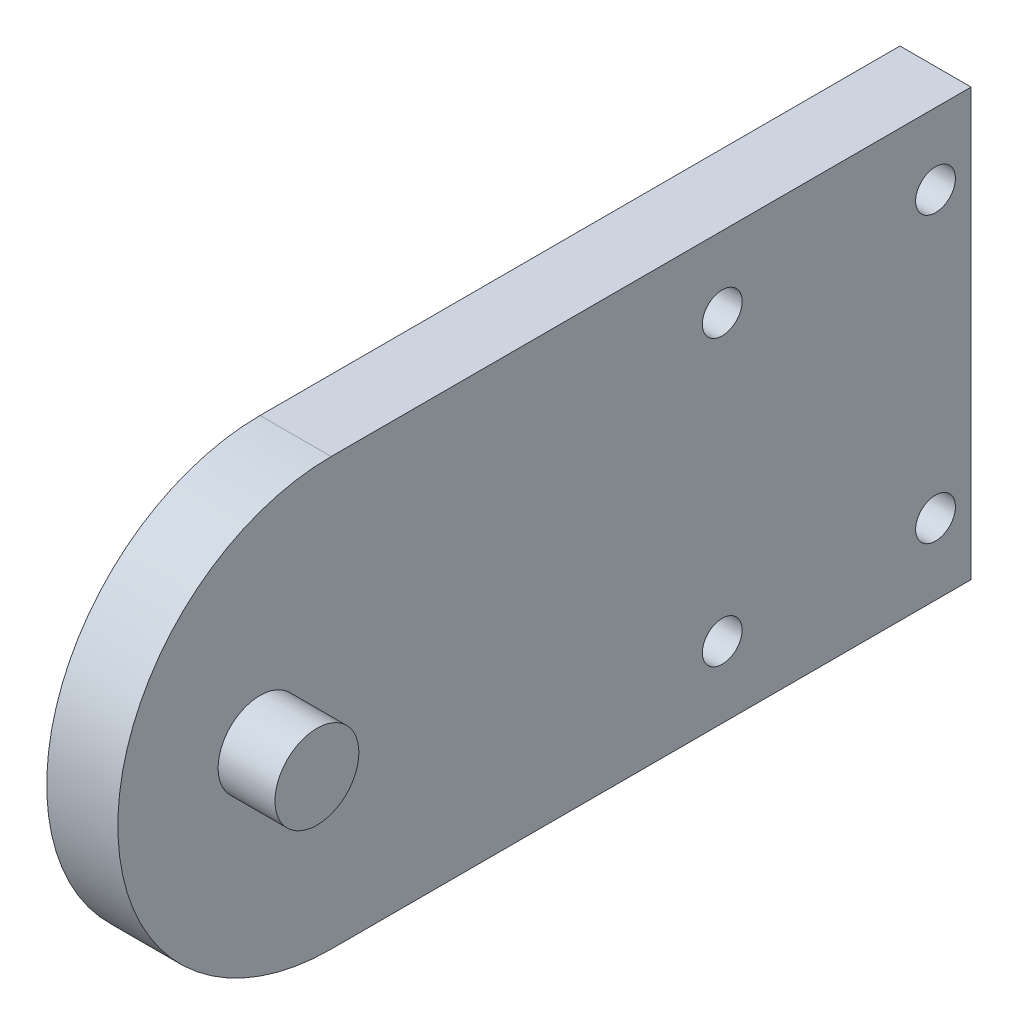
ISO-10303-21;
HEADER;
FILE_DESCRIPTION(('STEP AP214'),'2;1');
FILE_NAME('part.step','',(''),(''),'','','');
FILE_SCHEMA(('AUTOMOTIVE_DESIGN { 1 0 10303 214 1 1 1 1 }'));
ENDSEC;
DATA;
#1=APPLICATION_CONTEXT('core data for automotive mechanical design processes');
#2=APPLICATION_PROTOCOL_DEFINITION('international standard','automotive_design',2000,#1);
#3=PRODUCT_CONTEXT('',#1,'mechanical');
#4=PRODUCT('Part','Part','',(#3));
#5=PRODUCT_RELATED_PRODUCT_CATEGORY('part','',(#4));
#6=PRODUCT_DEFINITION_FORMATION('','',#4);
#7=PRODUCT_DEFINITION_CONTEXT('part definition',#1,'design');
#8=PRODUCT_DEFINITION('design','',#6,#7);
#9=PRODUCT_DEFINITION_SHAPE('','',#8);
#10=(LENGTH_UNIT() NAMED_UNIT(*) SI_UNIT(.MILLI.,.METRE.));
#11=(NAMED_UNIT(*) PLANE_ANGLE_UNIT() SI_UNIT($,.RADIAN.));
#12=(NAMED_UNIT(*) SI_UNIT($,.STERADIAN.) SOLID_ANGLE_UNIT());
#13=UNCERTAINTY_MEASURE_WITH_UNIT(LENGTH_MEASURE(1.E-05),#10,'distance_accuracy_value','');
#14=(GEOMETRIC_REPRESENTATION_CONTEXT(3) GLOBAL_UNCERTAINTY_ASSIGNED_CONTEXT((#13)) GLOBAL_UNIT_ASSIGNED_CONTEXT((#10,
#11,#12)) REPRESENTATION_CONTEXT('',''));
#15=CARTESIAN_POINT('',(0.,0.,0.));
#16=DIRECTION('',(0.,0.,1.));
#17=DIRECTION('',(1.,0.,0.));
#18=AXIS2_PLACEMENT_3D('',#15,#16,#17);
#19=CARTESIAN_POINT('',(0.,30.,0.));
#20=DIRECTION('',(0.,1.,0.));
#21=DIRECTION('',(0.,0.,1.));
#22=AXIS2_PLACEMENT_3D('',#19,#20,#21);
#23=PLANE('',#22);
#24=DIRECTION('',(0.,0.,1.));
#25=VECTOR('',#24,1.);
#26=CARTESIAN_POINT('',(-2.5,30.,-30.));
#27=LINE('',#26,#25);
#28=CARTESIAN_POINT('',(-2.5,30.,-30.));
#29=VERTEX_POINT('',#28);
#30=CARTESIAN_POINT('',(-2.5,30.,15.));
#31=VERTEX_POINT('',#30);
#32=EDGE_CURVE('E104',#29,#31,#27,.T.);
#33=ORIENTED_EDGE('',*,*,#32,.T.);
#34=DIRECTION('',(-1.,0.,0.));
#35=VECTOR('',#34,1.);
#36=CARTESIAN_POINT('',(7.5,30.,15.));
#37=LINE('',#36,#35);
#38=CARTESIAN_POINT('',(2.5,30.,15.));
#39=VERTEX_POINT('',#38);
#40=EDGE_CURVE('E12',#31,#39,#37,.F.);
#41=ORIENTED_EDGE('',*,*,#40,.T.);
#42=DIRECTION('',(0.,0.,-1.));
#43=VECTOR('',#42,1.);
#44=CARTESIAN_POINT('',(2.5,30.,-30.));
#45=LINE('',#44,#43);
#46=CARTESIAN_POINT('',(2.5,30.,-30.));
#47=VERTEX_POINT('',#46);
#48=EDGE_CURVE('E144',#39,#47,#45,.T.);
#49=ORIENTED_EDGE('',*,*,#48,.T.);
#50=DIRECTION('',(-1.,0.,0.));
#51=VECTOR('',#50,1.);
#52=CARTESIAN_POINT('',(-2.5,30.,-30.));
#53=LINE('',#52,#51);
#54=EDGE_CURVE('E81',#47,#29,#53,.T.);
#55=ORIENTED_EDGE('',*,*,#54,.T.);
#56=EDGE_LOOP('',(#33,#41,#49,#55));
#57=FACE_BOUND('',#56,.T.);
#58=ADVANCED_FACE('F57',(#57),#23,.T.);
#59=CARTESIAN_POINT('',(-2.5,30.,-30.));
#60=DIRECTION('',(1.,0.,0.));
#61=DIRECTION('',(0.,0.,-1.));
#62=AXIS2_PLACEMENT_3D('',#59,#60,#61);
#63=PLANE('',#62);
#64=CARTESIAN_POINT('',(-2.5,25.,-27.5));
#65=DIRECTION('',(-1.,0.,0.));
#66=DIRECTION('',(0.,0.,1.));
#67=AXIS2_PLACEMENT_3D('',#64,#65,#66);
#68=CIRCLE('',#67,1.4);
#69=CARTESIAN_POINT('',(-2.5,25.,-26.1));
#70=VERTEX_POINT('',#69);
#71=EDGE_CURVE('E127',#70,#70,#68,.T.);
#72=ORIENTED_EDGE('',*,*,#71,.F.);
#73=EDGE_LOOP('',(#72));
#74=FACE_BOUND('',#73,.T.);
#75=CARTESIAN_POINT('',(-2.5,25.,-12.5));
#76=DIRECTION('',(-1.,0.,0.));
#77=DIRECTION('',(0.,0.,1.));
#78=AXIS2_PLACEMENT_3D('',#75,#76,#77);
#79=CIRCLE('',#78,1.4);
#80=CARTESIAN_POINT('',(-2.5,25.,-11.1));
#81=VERTEX_POINT('',#80);
#82=EDGE_CURVE('E153',#81,#81,#79,.T.);
#83=ORIENTED_EDGE('',*,*,#82,.F.);
#84=EDGE_LOOP('',(#83));
#85=FACE_BOUND('',#84,.T.);
#86=CARTESIAN_POINT('',(-2.5,5.,-12.5));
#87=DIRECTION('',(-1.,0.,0.));
#88=DIRECTION('',(0.,0.,-1.));
#89=AXIS2_PLACEMENT_3D('',#86,#87,#88);
#90=CIRCLE('',#89,1.4);
#91=CARTESIAN_POINT('',(-2.5,5.,-13.9));
#92=VERTEX_POINT('',#91);
#93=EDGE_CURVE('E157',#92,#92,#90,.T.);
#94=ORIENTED_EDGE('',*,*,#93,.F.);
#95=EDGE_LOOP('',(#94));
#96=FACE_BOUND('',#95,.T.);
#97=CARTESIAN_POINT('',(-2.5,5.,-27.5));
#98=DIRECTION('',(-1.,0.,0.));
#99=DIRECTION('',(0.,0.,-1.));
#100=AXIS2_PLACEMENT_3D('',#97,#98,#99);
#101=CIRCLE('',#100,1.4);
#102=CARTESIAN_POINT('',(-2.5,5.,-28.9));
#103=VERTEX_POINT('',#102);
#104=EDGE_CURVE('E154',#103,#103,#101,.T.);
#105=ORIENTED_EDGE('',*,*,#104,.F.);
#106=EDGE_LOOP('',(#105));
#107=FACE_BOUND('',#106,.T.);
#108=CARTESIAN_POINT('',(-2.5,15.,15.));
#109=DIRECTION('',(-1.,0.,0.));
#110=DIRECTION('',(0.,0.,1.));
#111=AXIS2_PLACEMENT_3D('',#108,#109,#110);
#112=CIRCLE('',#111,15.);
#113=CARTESIAN_POINT('',(-2.5,0.,15.));
#114=VERTEX_POINT('',#113);
#115=EDGE_CURVE('E72',#114,#31,#112,.T.);
#116=ORIENTED_EDGE('',*,*,#115,.T.);
#117=ORIENTED_EDGE('',*,*,#32,.F.);
#118=DIRECTION('',(0.,-1.,0.));
#119=VECTOR('',#118,1.);
#120=CARTESIAN_POINT('',(-2.5,30.,-30.));
#121=LINE('',#120,#119);
#122=CARTESIAN_POINT('',(-2.5,0.,-30.));
#123=VERTEX_POINT('',#122);
#124=EDGE_CURVE('E97',#29,#123,#121,.T.);
#125=ORIENTED_EDGE('',*,*,#124,.T.);
#126=DIRECTION('',(0.,0.,1.));
#127=VECTOR('',#126,1.);
#128=CARTESIAN_POINT('',(-2.5,0.,-30.));
#129=LINE('',#128,#127);
#130=EDGE_CURVE('E109',#123,#114,#129,.T.);
#131=ORIENTED_EDGE('',*,*,#130,.T.);
#132=EDGE_LOOP('',(#116,#117,#125,#131));
#133=FACE_BOUND('',#132,.T.);
#134=ADVANCED_FACE('F59',(#74,#85,#96,#107,#133),#63,.F.);
#135=CARTESIAN_POINT('',(2.5,30.,-30.));
#136=DIRECTION('',(-1.,0.,0.));
#137=DIRECTION('',(0.,0.,1.));
#138=AXIS2_PLACEMENT_3D('',#135,#136,#137);
#139=PLANE('',#138);
#140=CARTESIAN_POINT('',(2.5,25.,-27.5));
#141=DIRECTION('',(-1.,0.,0.));
#142=DIRECTION('',(0.,0.,1.));
#143=AXIS2_PLACEMENT_3D('',#140,#141,#142);
#144=CIRCLE('',#143,1.4);
#145=CARTESIAN_POINT('',(2.5,25.,-26.1));
#146=VERTEX_POINT('',#145);
#147=EDGE_CURVE('E123',#146,#146,#144,.T.);
#148=ORIENTED_EDGE('',*,*,#147,.T.);
#149=EDGE_LOOP('',(#148));
#150=FACE_BOUND('',#149,.T.);
#151=CARTESIAN_POINT('',(2.5,25.,-12.5));
#152=DIRECTION('',(-1.,0.,0.));
#153=DIRECTION('',(0.,0.,1.));
#154=AXIS2_PLACEMENT_3D('',#151,#152,#153);
#155=CIRCLE('',#154,1.4);
#156=CARTESIAN_POINT('',(2.5,25.,-11.1));
#157=VERTEX_POINT('',#156);
#158=EDGE_CURVE('E126',#157,#157,#155,.T.);
#159=ORIENTED_EDGE('',*,*,#158,.T.);
#160=EDGE_LOOP('',(#159));
#161=FACE_BOUND('',#160,.T.);
#162=CARTESIAN_POINT('',(2.5,5.,-12.5));
#163=DIRECTION('',(-1.,0.,0.));
#164=DIRECTION('',(0.,0.,1.));
#165=AXIS2_PLACEMENT_3D('',#162,#163,#164);
#166=CIRCLE('',#165,1.4);
#167=CARTESIAN_POINT('',(2.5,5.,-11.1));
#168=VERTEX_POINT('',#167);
#169=EDGE_CURVE('E116',#168,#168,#166,.T.);
#170=ORIENTED_EDGE('',*,*,#169,.T.);
#171=EDGE_LOOP('',(#170));
#172=FACE_BOUND('',#171,.T.);
#173=CARTESIAN_POINT('',(2.5,5.,-27.5));
#174=DIRECTION('',(-1.,0.,0.));
#175=DIRECTION('',(0.,0.,1.));
#176=AXIS2_PLACEMENT_3D('',#173,#174,#175);
#177=CIRCLE('',#176,1.4);
#178=CARTESIAN_POINT('',(2.5,5.,-26.1));
#179=VERTEX_POINT('',#178);
#180=EDGE_CURVE('E112',#179,#179,#177,.T.);
#181=ORIENTED_EDGE('',*,*,#180,.T.);
#182=EDGE_LOOP('',(#181));
#183=FACE_BOUND('',#182,.T.);
#184=CARTESIAN_POINT('',(2.5,15.,20.));
#185=DIRECTION('',(-1.,0.,0.));
#186=DIRECTION('',(0.,0.,1.));
#187=AXIS2_PLACEMENT_3D('',#184,#185,#186);
#188=CIRCLE('',#187,2.95);
#189=CARTESIAN_POINT('',(2.5,15.,22.95));
#190=VERTEX_POINT('',#189);
#191=EDGE_CURVE('E122',#190,#190,#188,.F.);
#192=ORIENTED_EDGE('',*,*,#191,.F.);
#193=EDGE_LOOP('',(#192));
#194=FACE_BOUND('',#193,.T.);
#195=ORIENTED_EDGE('',*,*,#48,.F.);
#196=CARTESIAN_POINT('',(2.5,15.,15.));
#197=DIRECTION('',(-1.,0.,0.));
#198=DIRECTION('',(0.,0.,1.));
#199=AXIS2_PLACEMENT_3D('',#196,#197,#198);
#200=CIRCLE('',#199,15.);
#201=CARTESIAN_POINT('',(2.5,0.,15.));
#202=VERTEX_POINT('',#201);
#203=EDGE_CURVE('E146',#202,#39,#200,.T.);
#204=ORIENTED_EDGE('',*,*,#203,.F.);
#205=DIRECTION('',(0.,0.,-1.));
#206=VECTOR('',#205,1.);
#207=CARTESIAN_POINT('',(2.5,0.,-30.));
#208=LINE('',#207,#206);
#209=CARTESIAN_POINT('',(2.5,0.,-30.));
#210=VERTEX_POINT('',#209);
#211=EDGE_CURVE('E105',#202,#210,#208,.T.);
#212=ORIENTED_EDGE('',*,*,#211,.T.);
#213=DIRECTION('',(0.,-1.,0.));
#214=VECTOR('',#213,1.);
#215=CARTESIAN_POINT('',(2.5,30.,-30.));
#216=LINE('',#215,#214);
#217=EDGE_CURVE('E100',#47,#210,#216,.T.);
#218=ORIENTED_EDGE('',*,*,#217,.F.);
#219=EDGE_LOOP('',(#195,#204,#212,#218));
#220=FACE_BOUND('',#219,.T.);
#221=ADVANCED_FACE('F137',(#150,#161,#172,#183,#194,#220),#139,.F.);
#222=CARTESIAN_POINT('',(-2.5,30.,-30.));
#223=DIRECTION('',(0.,0.,1.));
#224=DIRECTION('',(1.,0.,0.));
#225=AXIS2_PLACEMENT_3D('',#222,#223,#224);
#226=PLANE('',#225);
#227=DIRECTION('',(-1.,0.,0.));
#228=VECTOR('',#227,1.);
#229=CARTESIAN_POINT('',(-2.5,0.,-30.));
#230=LINE('',#229,#228);
#231=EDGE_CURVE('E94',#210,#123,#230,.T.);
#232=ORIENTED_EDGE('',*,*,#231,.T.);
#233=ORIENTED_EDGE('',*,*,#124,.F.);
#234=ORIENTED_EDGE('',*,*,#54,.F.);
#235=ORIENTED_EDGE('',*,*,#217,.T.);
#236=EDGE_LOOP('',(#232,#233,#234,#235));
#237=FACE_BOUND('',#236,.T.);
#238=ADVANCED_FACE('F96',(#237),#226,.F.);
#239=CARTESIAN_POINT('',(0.,0.,0.));
#240=DIRECTION('',(0.,1.,0.));
#241=DIRECTION('',(0.,0.,1.));
#242=AXIS2_PLACEMENT_3D('',#239,#240,#241);
#243=PLANE('',#242);
#244=ORIENTED_EDGE('',*,*,#211,.F.);
#245=DIRECTION('',(-1.,0.,0.));
#246=VECTOR('',#245,1.);
#247=CARTESIAN_POINT('',(7.5,0.,15.));
#248=LINE('',#247,#246);
#249=EDGE_CURVE('E65',#202,#114,#248,.T.);
#250=ORIENTED_EDGE('',*,*,#249,.T.);
#251=ORIENTED_EDGE('',*,*,#130,.F.);
#252=ORIENTED_EDGE('',*,*,#231,.F.);
#253=EDGE_LOOP('',(#244,#250,#251,#252));
#254=FACE_BOUND('',#253,.T.);
#255=ADVANCED_FACE('F111',(#254),#243,.F.);
#256=CARTESIAN_POINT('',(3.5,25.,-27.5));
#257=DIRECTION('',(-1.,0.,0.));
#258=DIRECTION('',(0.,0.,1.));
#259=AXIS2_PLACEMENT_3D('',#256,#257,#258);
#260=CYLINDRICAL_SURFACE('',#259,1.4);
#261=ORIENTED_EDGE('',*,*,#71,.T.);
#262=EDGE_LOOP('',(#261));
#263=FACE_BOUND('',#262,.T.);
#264=ORIENTED_EDGE('',*,*,#147,.F.);
#265=EDGE_LOOP('',(#264));
#266=FACE_BOUND('',#265,.T.);
#267=ADVANCED_FACE('F177',(#263,#266),#260,.F.);
#268=CARTESIAN_POINT('',(3.5,25.,-12.5));
#269=DIRECTION('',(-1.,0.,0.));
#270=DIRECTION('',(0.,0.,1.));
#271=AXIS2_PLACEMENT_3D('',#268,#269,#270);
#272=CYLINDRICAL_SURFACE('',#271,1.4);
#273=ORIENTED_EDGE('',*,*,#82,.T.);
#274=EDGE_LOOP('',(#273));
#275=FACE_BOUND('',#274,.T.);
#276=ORIENTED_EDGE('',*,*,#158,.F.);
#277=EDGE_LOOP('',(#276));
#278=FACE_BOUND('',#277,.T.);
#279=ADVANCED_FACE('F192',(#275,#278),#272,.F.);
#280=CARTESIAN_POINT('',(3.5,5.,-12.5));
#281=DIRECTION('',(-1.,0.,0.));
#282=DIRECTION('',(0.,0.,1.));
#283=AXIS2_PLACEMENT_3D('',#280,#281,#282);
#284=CYLINDRICAL_SURFACE('',#283,1.4);
#285=ORIENTED_EDGE('',*,*,#93,.T.);
#286=EDGE_LOOP('',(#285));
#287=FACE_BOUND('',#286,.T.);
#288=ORIENTED_EDGE('',*,*,#169,.F.);
#289=EDGE_LOOP('',(#288));
#290=FACE_BOUND('',#289,.T.);
#291=ADVANCED_FACE('F200',(#287,#290),#284,.F.);
#292=CARTESIAN_POINT('',(3.5,5.,-27.5));
#293=DIRECTION('',(-1.,0.,0.));
#294=DIRECTION('',(0.,0.,1.));
#295=AXIS2_PLACEMENT_3D('',#292,#293,#294);
#296=CYLINDRICAL_SURFACE('',#295,1.4);
#297=ORIENTED_EDGE('',*,*,#104,.T.);
#298=EDGE_LOOP('',(#297));
#299=FACE_BOUND('',#298,.T.);
#300=ORIENTED_EDGE('',*,*,#180,.F.);
#301=EDGE_LOOP('',(#300));
#302=FACE_BOUND('',#301,.T.);
#303=ADVANCED_FACE('F209',(#299,#302),#296,.F.);
#304=CARTESIAN_POINT('',(6.5,15.,20.));
#305=DIRECTION('',(-1.,0.,0.));
#306=DIRECTION('',(0.,0.,1.));
#307=AXIS2_PLACEMENT_3D('',#304,#305,#306);
#308=CYLINDRICAL_SURFACE('',#307,2.95);
#309=CARTESIAN_POINT('',(6.5,15.,20.));
#310=DIRECTION('',(1.,0.,0.));
#311=DIRECTION('',(0.,0.,-1.));
#312=AXIS2_PLACEMENT_3D('',#309,#310,#311);
#313=CIRCLE('',#312,2.95);
#314=CARTESIAN_POINT('',(6.5,15.,17.05));
#315=VERTEX_POINT('',#314);
#316=EDGE_CURVE('E158',#315,#315,#313,.T.);
#317=ORIENTED_EDGE('',*,*,#316,.F.);
#318=EDGE_LOOP('',(#317));
#319=FACE_BOUND('',#318,.T.);
#320=ORIENTED_EDGE('',*,*,#191,.T.);
#321=EDGE_LOOP('',(#320));
#322=FACE_BOUND('',#321,.T.);
#323=ADVANCED_FACE('F135',(#319,#322),#308,.T.);
#324=CARTESIAN_POINT('',(6.5,15.,20.));
#325=DIRECTION('',(1.,0.,0.));
#326=DIRECTION('',(0.,0.,-1.));
#327=AXIS2_PLACEMENT_3D('',#324,#325,#326);
#328=PLANE('',#327);
#329=ORIENTED_EDGE('',*,*,#316,.T.);
#330=EDGE_LOOP('',(#329));
#331=FACE_BOUND('',#330,.T.);
#332=ADVANCED_FACE('F224',(#331),#328,.T.);
#333=CARTESIAN_POINT('',(7.5,15.,15.));
#334=DIRECTION('',(-1.,0.,0.));
#335=DIRECTION('',(0.,0.,1.));
#336=AXIS2_PLACEMENT_3D('',#333,#334,#335);
#337=CYLINDRICAL_SURFACE('',#336,15.);
#338=ORIENTED_EDGE('',*,*,#203,.T.);
#339=ORIENTED_EDGE('',*,*,#40,.F.);
#340=ORIENTED_EDGE('',*,*,#115,.F.);
#341=ORIENTED_EDGE('',*,*,#249,.F.);
#342=EDGE_LOOP('',(#338,#339,#340,#341));
#343=FACE_BOUND('',#342,.T.);
#344=ADVANCED_FACE('F167',(#343),#337,.T.);
#345=CLOSED_SHELL('',(#58,#134,#221,#238,#255,#267,#279,#291,#303,#323,#332,#344));
#346=MANIFOLD_SOLID_BREP('B2',#345);
#347=ADVANCED_BREP_SHAPE_REPRESENTATION('',(#18,#346),#14);
#348=SHAPE_DEFINITION_REPRESENTATION(#9,#347);
ENDSEC;
END-ISO-10303-21;
